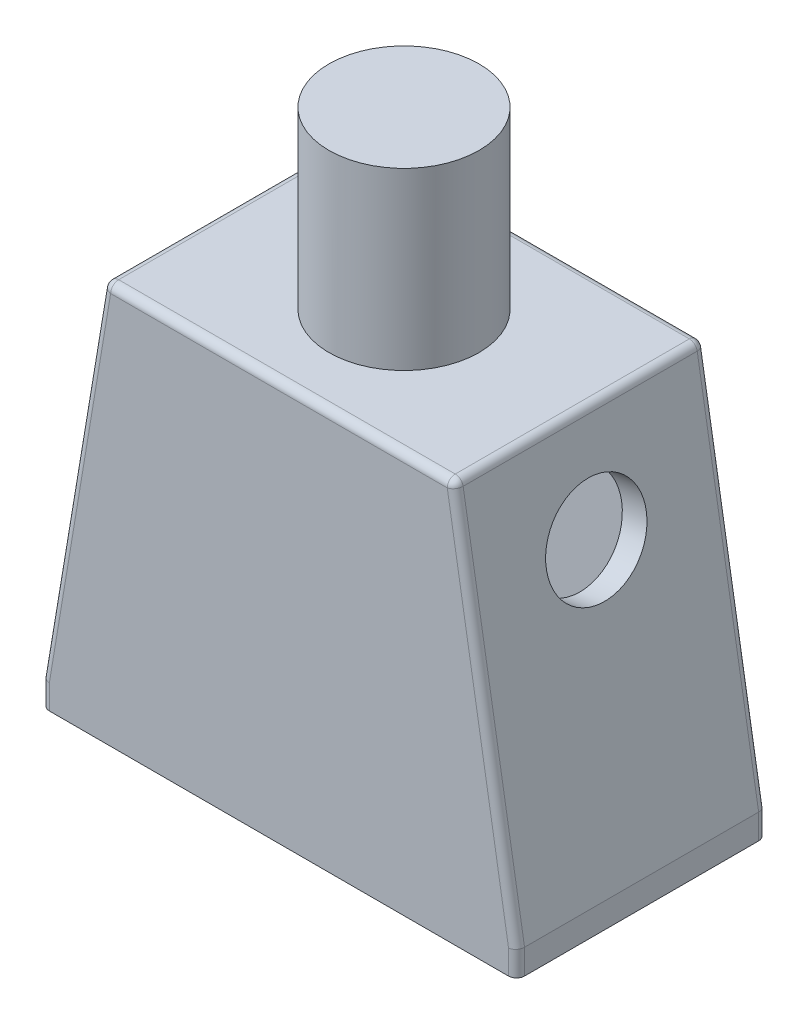
ISO-10303-21;
HEADER;
FILE_DESCRIPTION(('STEP AP214'),'2;1');
FILE_NAME('part.step','',(''),(''),'','','');
FILE_SCHEMA(('AUTOMOTIVE_DESIGN { 1 0 10303 214 1 1 1 1 }'));
ENDSEC;
DATA;
#1=APPLICATION_CONTEXT('core data for automotive mechanical design processes');
#2=APPLICATION_PROTOCOL_DEFINITION('international standard','automotive_design',2000,#1);
#3=PRODUCT_CONTEXT('',#1,'mechanical');
#4=PRODUCT('Part','Part','',(#3));
#5=PRODUCT_RELATED_PRODUCT_CATEGORY('part','',(#4));
#6=PRODUCT_DEFINITION_FORMATION('','',#4);
#7=PRODUCT_DEFINITION_CONTEXT('part definition',#1,'design');
#8=PRODUCT_DEFINITION('design','',#6,#7);
#9=PRODUCT_DEFINITION_SHAPE('','',#8);
#10=(LENGTH_UNIT() NAMED_UNIT(*) SI_UNIT(.MILLI.,.METRE.));
#11=(NAMED_UNIT(*) PLANE_ANGLE_UNIT() SI_UNIT($,.RADIAN.));
#12=(NAMED_UNIT(*) SI_UNIT($,.STERADIAN.) SOLID_ANGLE_UNIT());
#13=UNCERTAINTY_MEASURE_WITH_UNIT(LENGTH_MEASURE(1.E-05),#10,'distance_accuracy_value','');
#14=(GEOMETRIC_REPRESENTATION_CONTEXT(3) GLOBAL_UNCERTAINTY_ASSIGNED_CONTEXT((#13)) GLOBAL_UNIT_ASSIGNED_CONTEXT((#10,
#11,#12)) REPRESENTATION_CONTEXT('',''));
#15=CARTESIAN_POINT('',(0.,0.,0.));
#16=DIRECTION('',(0.,0.,1.));
#17=DIRECTION('',(1.,0.,0.));
#18=AXIS2_PLACEMENT_3D('',#15,#16,#17);
#19=CARTESIAN_POINT('',(0.,0.,3.96875));
#20=DIRECTION('',(0.,1.,0.));
#21=DIRECTION('',(-1.,0.,0.));
#22=AXIS2_PLACEMENT_3D('',#19,#20,#21);
#23=PLANE('',#22);
#24=DIRECTION('',(0.,0.,-1.));
#25=VECTOR('',#24,1.);
#26=CARTESIAN_POINT('',(0.,0.,3.96875));
#27=LINE('',#26,#25);
#28=CARTESIAN_POINT('',(0.,0.,3.71475));
#29=VERTEX_POINT('',#28);
#30=CARTESIAN_POINT('',(0.,0.,-3.71475));
#31=VERTEX_POINT('',#30);
#32=EDGE_CURVE('E282',#29,#31,#27,.T.);
#33=ORIENTED_EDGE('',*,*,#32,.T.);
#34=CARTESIAN_POINT('',(0.254,0.,-3.71475));
#35=DIRECTION('',(0.,1.,0.));
#36=DIRECTION('',(-1.,0.,0.));
#37=AXIS2_PLACEMENT_3D('',#34,#35,#36);
#38=CIRCLE('',#37,0.254);
#39=CARTESIAN_POINT('',(0.254,0.,-3.96875));
#40=VERTEX_POINT('',#39);
#41=EDGE_CURVE('E302',#31,#40,#38,.F.);
#42=ORIENTED_EDGE('',*,*,#41,.T.);
#43=DIRECTION('',(1.,0.,0.));
#44=VECTOR('',#43,1.);
#45=CARTESIAN_POINT('',(0.,0.,-3.96875));
#46=LINE('',#45,#44);
#47=CARTESIAN_POINT('',(14.82725,0.,-3.96875));
#48=VERTEX_POINT('',#47);
#49=EDGE_CURVE('E266',#40,#48,#46,.T.);
#50=ORIENTED_EDGE('',*,*,#49,.T.);
#51=CARTESIAN_POINT('',(14.82725,0.,-3.71475));
#52=DIRECTION('',(0.,1.,0.));
#53=DIRECTION('',(-1.,0.,0.));
#54=AXIS2_PLACEMENT_3D('',#51,#52,#53);
#55=CIRCLE('',#54,0.254);
#56=CARTESIAN_POINT('',(15.08125,0.,-3.71475));
#57=VERTEX_POINT('',#56);
#58=EDGE_CURVE('E299',#48,#57,#55,.F.);
#59=ORIENTED_EDGE('',*,*,#58,.T.);
#60=DIRECTION('',(0.,0.,-1.));
#61=VECTOR('',#60,1.);
#62=CARTESIAN_POINT('',(15.08125,0.,3.96875));
#63=LINE('',#62,#61);
#64=CARTESIAN_POINT('',(15.08125,0.,3.71475));
#65=VERTEX_POINT('',#64);
#66=EDGE_CURVE('E278',#65,#57,#63,.T.);
#67=ORIENTED_EDGE('',*,*,#66,.F.);
#68=CARTESIAN_POINT('',(14.82725,0.,3.71475));
#69=DIRECTION('',(0.,1.,0.));
#70=DIRECTION('',(-1.,0.,0.));
#71=AXIS2_PLACEMENT_3D('',#68,#69,#70);
#72=CIRCLE('',#71,0.254);
#73=CARTESIAN_POINT('',(14.82725,0.,3.96875));
#74=VERTEX_POINT('',#73);
#75=EDGE_CURVE('E296',#65,#74,#72,.F.);
#76=ORIENTED_EDGE('',*,*,#75,.T.);
#77=DIRECTION('',(1.,0.,0.));
#78=VECTOR('',#77,1.);
#79=CARTESIAN_POINT('',(0.,0.,3.96875));
#80=LINE('',#79,#78);
#81=CARTESIAN_POINT('',(0.254,0.,3.96875));
#82=VERTEX_POINT('',#81);
#83=EDGE_CURVE('E261',#82,#74,#80,.T.);
#84=ORIENTED_EDGE('',*,*,#83,.F.);
#85=CARTESIAN_POINT('',(0.254,0.,3.71475));
#86=DIRECTION('',(0.,1.,0.));
#87=DIRECTION('',(-1.,0.,0.));
#88=AXIS2_PLACEMENT_3D('',#85,#86,#87);
#89=CIRCLE('',#88,0.254);
#90=EDGE_CURVE('E293',#82,#29,#89,.F.);
#91=ORIENTED_EDGE('',*,*,#90,.T.);
#92=EDGE_LOOP('',(#33,#42,#50,#59,#67,#76,#84,#91));
#93=FACE_BOUND('',#92,.T.);
#94=DIRECTION('',(0.,0.,-1.));
#95=VECTOR('',#94,1.);
#96=CARTESIAN_POINT('',(0.79375,0.,3.96875));
#97=LINE('',#96,#95);
#98=CARTESIAN_POINT('',(0.79375,0.,3.175));
#99=VERTEX_POINT('',#98);
#100=CARTESIAN_POINT('',(0.79375,0.,-3.175));
#101=VERTEX_POINT('',#100);
#102=EDGE_CURVE('E188',#99,#101,#97,.T.);
#103=ORIENTED_EDGE('',*,*,#102,.F.);
#104=DIRECTION('',(1.,0.,0.));
#105=VECTOR('',#104,1.);
#106=CARTESIAN_POINT('',(0.,0.,3.175));
#107=LINE('',#106,#105);
#108=CARTESIAN_POINT('',(14.2875,0.,3.175));
#109=VERTEX_POINT('',#108);
#110=EDGE_CURVE('E212',#99,#109,#107,.T.);
#111=ORIENTED_EDGE('',*,*,#110,.T.);
#112=DIRECTION('',(0.,0.,-1.));
#113=VECTOR('',#112,1.);
#114=CARTESIAN_POINT('',(14.2875,0.,3.96875));
#115=LINE('',#114,#113);
#116=CARTESIAN_POINT('',(14.2875,0.,-3.175));
#117=VERTEX_POINT('',#116);
#118=EDGE_CURVE('E59',#109,#117,#115,.T.);
#119=ORIENTED_EDGE('',*,*,#118,.T.);
#120=DIRECTION('',(1.,0.,0.));
#121=VECTOR('',#120,1.);
#122=CARTESIAN_POINT('',(0.,0.,-3.175));
#123=LINE('',#122,#121);
#124=EDGE_CURVE('E220',#101,#117,#123,.T.);
#125=ORIENTED_EDGE('',*,*,#124,.F.);
#126=EDGE_LOOP('',(#103,#111,#119,#125));
#127=FACE_BOUND('',#126,.T.);
#128=ADVANCED_FACE('F41',(#93,#127),#23,.F.);
#129=CARTESIAN_POINT('',(0.,0.,3.96875));
#130=DIRECTION('',(1.,0.,0.));
#131=DIRECTION('',(0.,0.,-1.));
#132=AXIS2_PLACEMENT_3D('',#129,#130,#131);
#133=PLANE('',#132);
#134=DIRECTION('',(0.,0.,-1.));
#135=VECTOR('',#134,1.);
#136=CARTESIAN_POINT('',(0.,0.79375,3.96875));
#137=LINE('',#136,#135);
#138=CARTESIAN_POINT('',(0.,0.79375,3.71475));
#139=VERTEX_POINT('',#138);
#140=CARTESIAN_POINT('',(0.,0.79375,-3.71475));
#141=VERTEX_POINT('',#140);
#142=EDGE_CURVE('E265',#139,#141,#137,.T.);
#143=ORIENTED_EDGE('',*,*,#142,.T.);
#144=DIRECTION('',(0.,-1.,0.));
#145=VECTOR('',#144,1.);
#146=CARTESIAN_POINT('',(0.,0.,-3.71475));
#147=LINE('',#146,#145);
#148=EDGE_CURVE('E289',#141,#31,#147,.T.);
#149=ORIENTED_EDGE('',*,*,#148,.T.);
#150=ORIENTED_EDGE('',*,*,#32,.F.);
#151=DIRECTION('',(0.,-1.,0.));
#152=VECTOR('',#151,1.);
#153=CARTESIAN_POINT('',(0.,0.,3.71475));
#154=LINE('',#153,#152);
#155=EDGE_CURVE('E286',#29,#139,#154,.F.);
#156=ORIENTED_EDGE('',*,*,#155,.T.);
#157=EDGE_LOOP('',(#143,#149,#150,#156));
#158=FACE_BOUND('',#157,.T.);
#159=ADVANCED_FACE('F473',(#158),#133,.F.);
#160=CARTESIAN_POINT('',(15.08125,0.,3.96875));
#161=DIRECTION('',(-1.,0.,0.));
#162=DIRECTION('',(0.,0.,1.));
#163=AXIS2_PLACEMENT_3D('',#160,#161,#162);
#164=PLANE('',#163);
#165=ORIENTED_EDGE('',*,*,#66,.T.);
#166=DIRECTION('',(0.,1.,0.));
#167=VECTOR('',#166,1.);
#168=CARTESIAN_POINT('',(15.08125,0.793750000000002,-3.71475));
#169=LINE('',#168,#167);
#170=CARTESIAN_POINT('',(15.08125,0.793750000000002,-3.71475));
#171=VERTEX_POINT('',#170);
#172=EDGE_CURVE('E323',#57,#171,#169,.T.);
#173=ORIENTED_EDGE('',*,*,#172,.T.);
#174=DIRECTION('',(0.,0.,-1.));
#175=VECTOR('',#174,1.);
#176=CARTESIAN_POINT('',(15.08125,0.793750000000002,3.96875));
#177=LINE('',#176,#175);
#178=CARTESIAN_POINT('',(15.08125,0.793750000000002,3.71475));
#179=VERTEX_POINT('',#178);
#180=EDGE_CURVE('E274',#179,#171,#177,.T.);
#181=ORIENTED_EDGE('',*,*,#180,.F.);
#182=DIRECTION('',(0.,1.,0.));
#183=VECTOR('',#182,1.);
#184=CARTESIAN_POINT('',(15.08125,0.,3.71475));
#185=LINE('',#184,#183);
#186=EDGE_CURVE('E320',#179,#65,#185,.F.);
#187=ORIENTED_EDGE('',*,*,#186,.T.);
#188=EDGE_LOOP('',(#165,#173,#181,#187));
#189=FACE_BOUND('',#188,.T.);
#190=ADVANCED_FACE('F479',(#189),#164,.F.);
#191=CARTESIAN_POINT('',(13.096875,12.7,3.96875));
#192=DIRECTION('',(-0.986393923832144,-0.164398987305357,0.));
#193=DIRECTION('',(0.164398987305357,-0.986393923832144,0.));
#194=AXIS2_PLACEMENT_3D('',#191,#192,#193);
#195=PLANE('',#194);
#196=CARTESIAN_POINT('',(13.6440658621327,9.41685482720388,0.));
#197=DIRECTION('',(0.986393923832144,0.164398987305357,0.));
#198=DIRECTION('',(-0.164398987305357,0.986393923832144,0.));
#199=AXIS2_PLACEMENT_3D('',#196,#197,#198);
#200=CIRCLE('',#199,1.5875);
#201=CARTESIAN_POINT('',(13.3830824697854,10.9827551812874,0.));
#202=VERTEX_POINT('',#201);
#203=EDGE_CURVE('E434',#202,#202,#200,.T.);
#204=ORIENTED_EDGE('',*,*,#203,.F.);
#205=EDGE_LOOP('',(#204));
#206=FACE_BOUND('',#205,.T.);
#207=ORIENTED_EDGE('',*,*,#180,.T.);
#208=DIRECTION('',(-0.164398987305357,0.986393923832144,0.));
#209=VECTOR('',#208,1.);
#210=CARTESIAN_POINT('',(13.096875,12.7,-3.71475));
#211=LINE('',#210,#209);
#212=CARTESIAN_POINT('',(13.1322487762041,12.4877573427756,-3.71475));
#213=VERTEX_POINT('',#212);
#214=EDGE_CURVE('E360',#171,#213,#211,.T.);
#215=ORIENTED_EDGE('',*,*,#214,.T.);
#216=DIRECTION('',(0.,0.,-1.));
#217=VECTOR('',#216,1.);
#218=CARTESIAN_POINT('',(13.1322487762041,12.4877573427756,3.96875));
#219=LINE('',#218,#217);
#220=CARTESIAN_POINT('',(13.1322487762041,12.4877573427756,3.71475));
#221=VERTEX_POINT('',#220);
#222=EDGE_CURVE('E357',#213,#221,#219,.F.);
#223=ORIENTED_EDGE('',*,*,#222,.T.);
#224=DIRECTION('',(-0.164398987305357,0.986393923832144,0.));
#225=VECTOR('',#224,1.);
#226=CARTESIAN_POINT('',(13.096875,12.7,3.71475));
#227=LINE('',#226,#225);
#228=EDGE_CURVE('E354',#221,#179,#227,.F.);
#229=ORIENTED_EDGE('',*,*,#228,.T.);
#230=EDGE_LOOP('',(#207,#215,#223,#229));
#231=FACE_BOUND('',#230,.T.);
#232=ADVANCED_FACE('F468',(#206,#231),#195,.F.);
#233=CARTESIAN_POINT('',(1.984375,12.7,3.96875));
#234=DIRECTION('',(0.,-1.,0.));
#235=DIRECTION('',(1.,0.,0.));
#236=AXIS2_PLACEMENT_3D('',#233,#234,#235);
#237=PLANE('',#236);
#238=CARTESIAN_POINT('',(7.540625,12.7,0.));
#239=DIRECTION('',(0.,-1.,0.));
#240=DIRECTION('',(1.,0.,0.));
#241=AXIS2_PLACEMENT_3D('',#238,#239,#240);
#242=CIRCLE('',#241,2.38125000000002);
#243=CARTESIAN_POINT('',(9.92187500000002,12.7,0.));
#244=VERTEX_POINT('',#243);
#245=EDGE_CURVE('E11',#244,#244,#242,.F.);
#246=ORIENTED_EDGE('',*,*,#245,.F.);
#247=EDGE_LOOP('',(#246));
#248=FACE_BOUND('',#247,.T.);
#249=DIRECTION('',(-1.,0.,0.));
#250=VECTOR('',#249,1.);
#251=CARTESIAN_POINT('',(1.984375,12.7,3.71475));
#252=LINE('',#251,#250);
#253=CARTESIAN_POINT('',(2.19954528044929,12.7,3.71475));
#254=VERTEX_POINT('',#253);
#255=CARTESIAN_POINT('',(12.8817047195507,12.7,3.71475));
#256=VERTEX_POINT('',#255);
#257=EDGE_CURVE('E347',#254,#256,#252,.F.);
#258=ORIENTED_EDGE('',*,*,#257,.T.);
#259=DIRECTION('',(0.,0.,-1.));
#260=VECTOR('',#259,1.);
#261=CARTESIAN_POINT('',(12.8817047195507,12.7,3.96875));
#262=LINE('',#261,#260);
#263=CARTESIAN_POINT('',(12.8817047195507,12.7,-3.71475));
#264=VERTEX_POINT('',#263);
#265=EDGE_CURVE('E350',#256,#264,#262,.T.);
#266=ORIENTED_EDGE('',*,*,#265,.T.);
#267=DIRECTION('',(-1.,0.,0.));
#268=VECTOR('',#267,1.);
#269=CARTESIAN_POINT('',(1.984375,12.7,-3.71475));
#270=LINE('',#269,#268);
#271=CARTESIAN_POINT('',(2.19954528044929,12.7,-3.71475));
#272=VERTEX_POINT('',#271);
#273=EDGE_CURVE('E341',#264,#272,#270,.T.);
#274=ORIENTED_EDGE('',*,*,#273,.T.);
#275=DIRECTION('',(0.,0.,-1.));
#276=VECTOR('',#275,1.);
#277=CARTESIAN_POINT('',(2.19954528044929,12.7,3.96875));
#278=LINE('',#277,#276);
#279=EDGE_CURVE('E344',#272,#254,#278,.F.);
#280=ORIENTED_EDGE('',*,*,#279,.T.);
#281=EDGE_LOOP('',(#258,#266,#274,#280));
#282=FACE_BOUND('',#281,.T.);
#283=ADVANCED_FACE('F459',(#248,#282),#237,.F.);
#284=CARTESIAN_POINT('',(0.,0.79375,3.96875));
#285=DIRECTION('',(0.986393923832144,-0.164398987305357,0.));
#286=DIRECTION('',(0.164398987305357,0.986393923832144,0.));
#287=AXIS2_PLACEMENT_3D('',#284,#285,#286);
#288=PLANE('',#287);
#289=CARTESIAN_POINT('',(1.43718413786731,9.41685482720387,0.));
#290=DIRECTION('',(-0.986393923832144,0.164398987305357,0.));
#291=DIRECTION('',(-0.164398987305357,-0.986393923832144,0.));
#292=AXIS2_PLACEMENT_3D('',#289,#290,#291);
#293=CIRCLE('',#292,1.5875);
#294=CARTESIAN_POINT('',(1.17620074552006,7.85095447312035,0.));
#295=VERTEX_POINT('',#294);
#296=EDGE_CURVE('E447',#295,#295,#293,.T.);
#297=ORIENTED_EDGE('',*,*,#296,.F.);
#298=EDGE_LOOP('',(#297));
#299=FACE_BOUND('',#298,.T.);
#300=DIRECTION('',(0.,0.,-1.));
#301=VECTOR('',#300,1.);
#302=CARTESIAN_POINT('',(1.94900122379593,12.4877573427756,3.96875));
#303=LINE('',#302,#301);
#304=CARTESIAN_POINT('',(1.94900122379593,12.4877573427756,3.71475));
#305=VERTEX_POINT('',#304);
#306=CARTESIAN_POINT('',(1.94900122379593,12.4877573427756,-3.71475));
#307=VERTEX_POINT('',#306);
#308=EDGE_CURVE('E67',#305,#307,#303,.T.);
#309=ORIENTED_EDGE('',*,*,#308,.T.);
#310=DIRECTION('',(-0.164398987305357,-0.986393923832144,0.));
#311=VECTOR('',#310,1.);
#312=CARTESIAN_POINT('',(0.,0.79375,-3.71475));
#313=LINE('',#312,#311);
#314=EDGE_CURVE('E51',#307,#141,#313,.T.);
#315=ORIENTED_EDGE('',*,*,#314,.T.);
#316=ORIENTED_EDGE('',*,*,#142,.F.);
#317=DIRECTION('',(-0.164398987305357,-0.986393923832144,0.));
#318=VECTOR('',#317,1.);
#319=CARTESIAN_POINT('',(0.,0.79375,3.71475));
#320=LINE('',#319,#318);
#321=EDGE_CURVE('E363',#139,#305,#320,.F.);
#322=ORIENTED_EDGE('',*,*,#321,.T.);
#323=EDGE_LOOP('',(#309,#315,#316,#322));
#324=FACE_BOUND('',#323,.T.);
#325=ADVANCED_FACE('F456',(#299,#324),#288,.F.);
#326=CARTESIAN_POINT('',(0.,0.,3.96875));
#327=DIRECTION('',(0.,0.,-1.));
#328=DIRECTION('',(-1.,0.,0.));
#329=AXIS2_PLACEMENT_3D('',#326,#327,#328);
#330=PLANE('',#329);
#331=DIRECTION('',(-0.164398987305357,-0.986393923832144,0.));
#332=VECTOR('',#331,1.);
#333=CARTESIAN_POINT('',(0.121827840437148,-0.0203046400728581,3.96875));
#334=LINE('',#333,#332);
#335=CARTESIAN_POINT('',(2.19954528044929,12.446,3.96875));
#336=VERTEX_POINT('',#335);
#337=CARTESIAN_POINT('',(0.254,0.772728317304252,3.96875));
#338=VERTEX_POINT('',#337);
#339=EDGE_CURVE('E335',#336,#338,#334,.T.);
#340=ORIENTED_EDGE('',*,*,#339,.T.);
#341=DIRECTION('',(0.,-1.,0.));
#342=VECTOR('',#341,1.);
#343=CARTESIAN_POINT('',(0.254,0.,3.96875));
#344=LINE('',#343,#342);
#345=EDGE_CURVE('E338',#338,#82,#344,.T.);
#346=ORIENTED_EDGE('',*,*,#345,.T.);
#347=ORIENTED_EDGE('',*,*,#83,.T.);
#348=DIRECTION('',(0.,1.,0.));
#349=VECTOR('',#348,1.);
#350=CARTESIAN_POINT('',(14.82725,0.,3.96875));
#351=LINE('',#350,#349);
#352=CARTESIAN_POINT('',(14.82725,0.772728317304272,3.96875));
#353=VERTEX_POINT('',#352);
#354=EDGE_CURVE('E332',#74,#353,#351,.T.);
#355=ORIENTED_EDGE('',*,*,#354,.T.);
#356=DIRECTION('',(-0.164398987305357,0.986393923832144,0.));
#357=VECTOR('',#356,1.);
#358=CARTESIAN_POINT('',(14.5518208082115,2.42530346803525,3.96875));
#359=LINE('',#358,#357);
#360=CARTESIAN_POINT('',(12.8817047195507,12.446,3.96875));
#361=VERTEX_POINT('',#360);
#362=EDGE_CURVE('E326',#353,#361,#359,.T.);
#363=ORIENTED_EDGE('',*,*,#362,.T.);
#364=DIRECTION('',(-1.,0.,0.));
#365=VECTOR('',#364,1.);
#366=CARTESIAN_POINT('',(0.,12.446,3.96875));
#367=LINE('',#366,#365);
#368=EDGE_CURVE('E329',#361,#336,#367,.T.);
#369=ORIENTED_EDGE('',*,*,#368,.T.);
#370=EDGE_LOOP('',(#340,#346,#347,#355,#363,#369));
#371=FACE_BOUND('',#370,.T.);
#372=ADVANCED_FACE('F458',(#371),#330,.F.);
#373=CARTESIAN_POINT('',(0.,0.,-3.96875));
#374=DIRECTION('',(0.,0.,-1.));
#375=DIRECTION('',(-1.,0.,0.));
#376=AXIS2_PLACEMENT_3D('',#373,#374,#375);
#377=PLANE('',#376);
#378=ORIENTED_EDGE('',*,*,#49,.F.);
#379=DIRECTION('',(0.,-1.,0.));
#380=VECTOR('',#379,1.);
#381=CARTESIAN_POINT('',(0.254,0.79375,-3.96875));
#382=LINE('',#381,#380);
#383=CARTESIAN_POINT('',(0.254,0.772728317304252,-3.96875));
#384=VERTEX_POINT('',#383);
#385=EDGE_CURVE('E317',#40,#384,#382,.F.);
#386=ORIENTED_EDGE('',*,*,#385,.T.);
#387=DIRECTION('',(-0.164398987305357,-0.986393923832144,0.));
#388=VECTOR('',#387,1.);
#389=CARTESIAN_POINT('',(2.23491905665336,12.6582426572244,-3.96875));
#390=LINE('',#389,#388);
#391=CARTESIAN_POINT('',(2.19954528044929,12.446,-3.96875));
#392=VERTEX_POINT('',#391);
#393=EDGE_CURVE('E314',#384,#392,#390,.F.);
#394=ORIENTED_EDGE('',*,*,#393,.T.);
#395=DIRECTION('',(-1.,0.,0.));
#396=VECTOR('',#395,1.);
#397=CARTESIAN_POINT('',(13.096875,12.446,-3.96875));
#398=LINE('',#397,#396);
#399=CARTESIAN_POINT('',(12.8817047195507,12.446,-3.96875));
#400=VERTEX_POINT('',#399);
#401=EDGE_CURVE('E308',#392,#400,#398,.F.);
#402=ORIENTED_EDGE('',*,*,#401,.T.);
#403=DIRECTION('',(-0.164398987305357,0.986393923832144,0.));
#404=VECTOR('',#403,1.);
#405=CARTESIAN_POINT('',(14.8307059433466,0.751992657224436,-3.96875));
#406=LINE('',#405,#404);
#407=CARTESIAN_POINT('',(14.82725,0.772728317304265,-3.96875));
#408=VERTEX_POINT('',#407);
#409=EDGE_CURVE('E305',#400,#408,#406,.F.);
#410=ORIENTED_EDGE('',*,*,#409,.T.);
#411=DIRECTION('',(0.,1.,0.));
#412=VECTOR('',#411,1.);
#413=CARTESIAN_POINT('',(14.82725,0.,-3.96875));
#414=LINE('',#413,#412);
#415=EDGE_CURVE('E311',#408,#48,#414,.F.);
#416=ORIENTED_EDGE('',*,*,#415,.T.);
#417=EDGE_LOOP('',(#378,#386,#394,#402,#410,#416));
#418=FACE_BOUND('',#417,.T.);
#419=ADVANCED_FACE('F465',(#418),#377,.T.);
#420=CARTESIAN_POINT('',(14.82725,0.,3.71475));
#421=DIRECTION('',(0.,1.,0.));
#422=DIRECTION('',(0.,0.,1.));
#423=AXIS2_PLACEMENT_3D('',#420,#421,#422);
#424=CYLINDRICAL_SURFACE('',#423,0.254);
#425=ORIENTED_EDGE('',*,*,#75,.F.);
#426=ORIENTED_EDGE('',*,*,#186,.F.);
#427=CARTESIAN_POINT('',(14.82725,0.772728317304277,3.71475));
#428=DIRECTION('',(-0.0824805315448933,0.996592676029717,0.));
#429=DIRECTION('',(-0.996592676029717,-0.0824805315448924,0.));
#430=AXIS2_PLACEMENT_3D('',#427,#428,#429);
#431=ELLIPSE('',#430,0.254868419274261,0.254);
#432=EDGE_CURVE('E270',#353,#179,#431,.T.);
#433=ORIENTED_EDGE('',*,*,#432,.F.);
#434=ORIENTED_EDGE('',*,*,#354,.F.);
#435=EDGE_LOOP('',(#425,#426,#433,#434));
#436=FACE_BOUND('',#435,.T.);
#437=ADVANCED_FACE('F43',(#436),#424,.T.);
#438=CARTESIAN_POINT('',(14.5518208082115,2.42530346803525,3.71475));
#439=DIRECTION('',(-0.164398987305357,0.986393923832144,0.));
#440=DIRECTION('',(-0.986393923832144,-0.164398987305357,0.));
#441=AXIS2_PLACEMENT_3D('',#438,#439,#440);
#442=CYLINDRICAL_SURFACE('',#441,0.254);
#443=ORIENTED_EDGE('',*,*,#432,.T.);
#444=ORIENTED_EDGE('',*,*,#228,.F.);
#445=CARTESIAN_POINT('',(12.8817047195507,12.446,3.71475));
#446=DIRECTION('',(-0.164398987305361,0.986393923832143,0.));
#447=DIRECTION('',(-0.986393923832143,-0.164398987305361,0.));
#448=AXIS2_PLACEMENT_3D('',#445,#446,#447);
#449=CIRCLE('',#448,0.254);
#450=EDGE_CURVE('E425',#361,#221,#449,.T.);
#451=ORIENTED_EDGE('',*,*,#450,.F.);
#452=ORIENTED_EDGE('',*,*,#362,.F.);
#453=EDGE_LOOP('',(#443,#444,#451,#452));
#454=FACE_BOUND('',#453,.T.);
#455=ADVANCED_FACE('F540',(#454),#442,.T.);
#456=CARTESIAN_POINT('',(14.82725,0.,-3.71475));
#457=DIRECTION('',(0.,-1.,0.));
#458=DIRECTION('',(0.,0.,-1.));
#459=AXIS2_PLACEMENT_3D('',#456,#457,#458);
#460=CYLINDRICAL_SURFACE('',#459,0.254);
#461=ORIENTED_EDGE('',*,*,#58,.F.);
#462=ORIENTED_EDGE('',*,*,#415,.F.);
#463=CARTESIAN_POINT('',(14.82725,0.772728317304266,-3.71475));
#464=DIRECTION('',(0.0824805315448933,-0.996592676029717,0.));
#465=DIRECTION('',(0.996592676029717,0.0824805315448924,0.));
#466=AXIS2_PLACEMENT_3D('',#463,#464,#465);
#467=ELLIPSE('',#466,0.254868419274261,0.254);
#468=EDGE_CURVE('E421',#171,#408,#467,.F.);
#469=ORIENTED_EDGE('',*,*,#468,.F.);
#470=ORIENTED_EDGE('',*,*,#172,.F.);
#471=EDGE_LOOP('',(#461,#462,#469,#470));
#472=FACE_BOUND('',#471,.T.);
#473=ADVANCED_FACE('F537',(#472),#460,.T.);
#474=CARTESIAN_POINT('',(12.8817047195507,12.446,3.71475));
#475=DIRECTION('',(0.,0.,1.));
#476=DIRECTION('',(1.,0.,0.));
#477=AXIS2_PLACEMENT_3D('',#474,#475,#476);
#478=SPHERICAL_SURFACE('',#477,0.254);
#479=CARTESIAN_POINT('',(12.8817047195507,12.446,3.71475));
#480=DIRECTION('',(1.,0.,0.));
#481=DIRECTION('',(0.,0.,-1.));
#482=AXIS2_PLACEMENT_3D('',#479,#480,#481);
#483=CIRCLE('',#482,0.254);
#484=EDGE_CURVE('E413',#361,#256,#483,.F.);
#485=ORIENTED_EDGE('',*,*,#484,.F.);
#486=ORIENTED_EDGE('',*,*,#450,.T.);
#487=CARTESIAN_POINT('',(12.8817047195507,12.446,3.71475));
#488=DIRECTION('',(0.,0.,1.));
#489=DIRECTION('',(1.,0.,0.));
#490=AXIS2_PLACEMENT_3D('',#487,#488,#489);
#491=CIRCLE('',#490,0.254);
#492=EDGE_CURVE('E417',#256,#221,#491,.F.);
#493=ORIENTED_EDGE('',*,*,#492,.F.);
#494=EDGE_LOOP('',(#485,#486,#493));
#495=FACE_BOUND('',#494,.T.);
#496=ADVANCED_FACE('F533',(#495),#478,.T.);
#497=CARTESIAN_POINT('',(0.254,0.,3.71475));
#498=DIRECTION('',(0.,-1.,0.));
#499=DIRECTION('',(0.,0.,-1.));
#500=AXIS2_PLACEMENT_3D('',#497,#498,#499);
#501=CYLINDRICAL_SURFACE('',#500,0.254);
#502=ORIENTED_EDGE('',*,*,#90,.F.);
#503=ORIENTED_EDGE('',*,*,#345,.F.);
#504=CARTESIAN_POINT('',(0.254,0.772728317304252,3.71475));
#505=DIRECTION('',(-0.0824805315448932,-0.996592676029717,0.));
#506=DIRECTION('',(-0.996592676029717,0.0824805315448925,0.));
#507=AXIS2_PLACEMENT_3D('',#504,#505,#506);
#508=ELLIPSE('',#507,0.254868419274261,0.254);
#509=EDGE_CURVE('E409',#139,#338,#508,.F.);
#510=ORIENTED_EDGE('',*,*,#509,.F.);
#511=ORIENTED_EDGE('',*,*,#155,.F.);
#512=EDGE_LOOP('',(#502,#503,#510,#511));
#513=FACE_BOUND('',#512,.T.);
#514=ADVANCED_FACE('F529',(#513),#501,.T.);
#515=CARTESIAN_POINT('',(12.8463309433466,12.6582426572244,-3.71475));
#516=DIRECTION('',(0.164398987305357,-0.986393923832144,0.));
#517=DIRECTION('',(0.986393923832144,0.164398987305357,0.));
#518=AXIS2_PLACEMENT_3D('',#515,#516,#517);
#519=CYLINDRICAL_SURFACE('',#518,0.254);
#520=ORIENTED_EDGE('',*,*,#468,.T.);
#521=ORIENTED_EDGE('',*,*,#409,.F.);
#522=CARTESIAN_POINT('',(12.8817047195507,12.446,-3.71475));
#523=DIRECTION('',(-0.164398987305359,0.986393923832143,0.));
#524=DIRECTION('',(-0.986393923832143,-0.164398987305359,0.));
#525=AXIS2_PLACEMENT_3D('',#522,#523,#524);
#526=CIRCLE('',#525,0.254);
#527=EDGE_CURVE('E405',#213,#400,#526,.T.);
#528=ORIENTED_EDGE('',*,*,#527,.F.);
#529=ORIENTED_EDGE('',*,*,#214,.F.);
#530=EDGE_LOOP('',(#520,#521,#528,#529));
#531=FACE_BOUND('',#530,.T.);
#532=ADVANCED_FACE('F525',(#531),#519,.T.);
#533=CARTESIAN_POINT('',(12.8817047195507,12.446,3.96875));
#534=DIRECTION('',(0.,0.,-1.));
#535=DIRECTION('',(-1.,0.,0.));
#536=AXIS2_PLACEMENT_3D('',#533,#534,#535);
#537=CYLINDRICAL_SURFACE('',#536,0.254);
#538=ORIENTED_EDGE('',*,*,#492,.T.);
#539=ORIENTED_EDGE('',*,*,#222,.F.);
#540=CARTESIAN_POINT('',(12.8817047195507,12.446,-3.71475));
#541=DIRECTION('',(0.,0.,-1.));
#542=DIRECTION('',(-1.,0.,0.));
#543=AXIS2_PLACEMENT_3D('',#540,#541,#542);
#544=CIRCLE('',#543,0.254);
#545=EDGE_CURVE('E401',#264,#213,#544,.T.);
#546=ORIENTED_EDGE('',*,*,#545,.F.);
#547=ORIENTED_EDGE('',*,*,#265,.F.);
#548=EDGE_LOOP('',(#538,#539,#546,#547));
#549=FACE_BOUND('',#548,.T.);
#550=ADVANCED_FACE('F521',(#549),#537,.T.);
#551=CARTESIAN_POINT('',(0.,12.446,3.71475));
#552=DIRECTION('',(-1.,0.,0.));
#553=DIRECTION('',(0.,-1.,0.));
#554=AXIS2_PLACEMENT_3D('',#551,#552,#553);
#555=CYLINDRICAL_SURFACE('',#554,0.254);
#556=ORIENTED_EDGE('',*,*,#484,.T.);
#557=ORIENTED_EDGE('',*,*,#257,.F.);
#558=CARTESIAN_POINT('',(2.19954528044929,12.446,3.71475));
#559=DIRECTION('',(-1.,0.,0.));
#560=DIRECTION('',(0.,0.,1.));
#561=AXIS2_PLACEMENT_3D('',#558,#559,#560);
#562=CIRCLE('',#561,0.254);
#563=EDGE_CURVE('E397',#336,#254,#562,.T.);
#564=ORIENTED_EDGE('',*,*,#563,.F.);
#565=ORIENTED_EDGE('',*,*,#368,.F.);
#566=EDGE_LOOP('',(#556,#557,#564,#565));
#567=FACE_BOUND('',#566,.T.);
#568=ADVANCED_FACE('F517',(#567),#555,.T.);
#569=CARTESIAN_POINT('',(0.121827840437148,-0.0203046400728581,3.71475));
#570=DIRECTION('',(-0.164398987305357,-0.986393923832144,0.));
#571=DIRECTION('',(0.986393923832144,-0.164398987305357,0.));
#572=AXIS2_PLACEMENT_3D('',#569,#570,#571);
#573=CYLINDRICAL_SURFACE('',#572,0.254);
#574=ORIENTED_EDGE('',*,*,#509,.T.);
#575=ORIENTED_EDGE('',*,*,#339,.F.);
#576=CARTESIAN_POINT('',(2.19954528044929,12.446,3.71475));
#577=DIRECTION('',(0.164398987305359,0.986393923832143,0.));
#578=DIRECTION('',(-0.986393923832143,0.164398987305359,0.));
#579=AXIS2_PLACEMENT_3D('',#576,#577,#578);
#580=CIRCLE('',#579,0.254);
#581=EDGE_CURVE('E393',#305,#336,#580,.T.);
#582=ORIENTED_EDGE('',*,*,#581,.F.);
#583=ORIENTED_EDGE('',*,*,#321,.F.);
#584=EDGE_LOOP('',(#574,#575,#582,#583));
#585=FACE_BOUND('',#584,.T.);
#586=ADVANCED_FACE('F513',(#585),#573,.T.);
#587=CARTESIAN_POINT('',(12.8817047195507,12.446,-3.71475));
#588=DIRECTION('',(0.,0.,-1.));
#589=DIRECTION('',(-1.,0.,0.));
#590=AXIS2_PLACEMENT_3D('',#587,#588,#589);
#591=SPHERICAL_SURFACE('',#590,0.254);
#592=ORIENTED_EDGE('',*,*,#545,.T.);
#593=ORIENTED_EDGE('',*,*,#527,.T.);
#594=CARTESIAN_POINT('',(12.8817047195507,12.446,-3.71475));
#595=DIRECTION('',(1.,0.,0.));
#596=DIRECTION('',(0.,0.,-1.));
#597=AXIS2_PLACEMENT_3D('',#594,#595,#596);
#598=CIRCLE('',#597,0.254);
#599=EDGE_CURVE('E389',#264,#400,#598,.F.);
#600=ORIENTED_EDGE('',*,*,#599,.F.);
#601=EDGE_LOOP('',(#592,#593,#600));
#602=FACE_BOUND('',#601,.T.);
#603=ADVANCED_FACE('F509',(#602),#591,.T.);
#604=CARTESIAN_POINT('',(2.19954528044929,12.446,3.71475));
#605=DIRECTION('',(0.,0.,1.));
#606=DIRECTION('',(1.,0.,0.));
#607=AXIS2_PLACEMENT_3D('',#604,#605,#606);
#608=SPHERICAL_SURFACE('',#607,0.254);
#609=ORIENTED_EDGE('',*,*,#581,.T.);
#610=ORIENTED_EDGE('',*,*,#563,.T.);
#611=CARTESIAN_POINT('',(2.19954528044929,12.446,3.71475));
#612=DIRECTION('',(0.,0.,1.));
#613=DIRECTION('',(1.,0.,0.));
#614=AXIS2_PLACEMENT_3D('',#611,#612,#613);
#615=CIRCLE('',#614,0.254);
#616=EDGE_CURVE('E385',#305,#254,#615,.F.);
#617=ORIENTED_EDGE('',*,*,#616,.F.);
#618=EDGE_LOOP('',(#609,#610,#617));
#619=FACE_BOUND('',#618,.T.);
#620=ADVANCED_FACE('F505',(#619),#608,.T.);
#621=CARTESIAN_POINT('',(1.984375,12.446,-3.71475));
#622=DIRECTION('',(1.,0.,0.));
#623=DIRECTION('',(0.,1.,0.));
#624=AXIS2_PLACEMENT_3D('',#621,#622,#623);
#625=CYLINDRICAL_SURFACE('',#624,0.254);
#626=ORIENTED_EDGE('',*,*,#599,.T.);
#627=ORIENTED_EDGE('',*,*,#401,.F.);
#628=CARTESIAN_POINT('',(2.19954528044929,12.446,-3.71475));
#629=DIRECTION('',(-1.,0.,0.));
#630=DIRECTION('',(0.,0.,1.));
#631=AXIS2_PLACEMENT_3D('',#628,#629,#630);
#632=CIRCLE('',#631,0.254);
#633=EDGE_CURVE('E381',#272,#392,#632,.T.);
#634=ORIENTED_EDGE('',*,*,#633,.F.);
#635=ORIENTED_EDGE('',*,*,#273,.F.);
#636=EDGE_LOOP('',(#626,#627,#634,#635));
#637=FACE_BOUND('',#636,.T.);
#638=ADVANCED_FACE('F501',(#637),#625,.T.);
#639=CARTESIAN_POINT('',(2.19954528044929,12.446,3.96875));
#640=DIRECTION('',(0.,0.,-1.));
#641=DIRECTION('',(-1.,0.,0.));
#642=AXIS2_PLACEMENT_3D('',#639,#640,#641);
#643=CYLINDRICAL_SURFACE('',#642,0.254);
#644=ORIENTED_EDGE('',*,*,#616,.T.);
#645=ORIENTED_EDGE('',*,*,#279,.F.);
#646=CARTESIAN_POINT('',(2.19954528044929,12.446,-3.71475));
#647=DIRECTION('',(0.,0.,-1.));
#648=DIRECTION('',(-1.,0.,0.));
#649=AXIS2_PLACEMENT_3D('',#646,#647,#648);
#650=CIRCLE('',#649,0.254);
#651=EDGE_CURVE('E377',#307,#272,#650,.T.);
#652=ORIENTED_EDGE('',*,*,#651,.F.);
#653=ORIENTED_EDGE('',*,*,#308,.F.);
#654=EDGE_LOOP('',(#644,#645,#652,#653));
#655=FACE_BOUND('',#654,.T.);
#656=ADVANCED_FACE('F497',(#655),#643,.T.);
#657=CARTESIAN_POINT('',(2.19954528044929,12.446,-3.71475));
#658=DIRECTION('',(0.,0.,-1.));
#659=DIRECTION('',(-1.,0.,0.));
#660=AXIS2_PLACEMENT_3D('',#657,#658,#659);
#661=SPHERICAL_SURFACE('',#660,0.254);
#662=ORIENTED_EDGE('',*,*,#651,.T.);
#663=ORIENTED_EDGE('',*,*,#633,.T.);
#664=CARTESIAN_POINT('',(2.19954528044929,12.446,-3.71475));
#665=DIRECTION('',(0.16439898730536,0.986393923832143,0.));
#666=DIRECTION('',(-0.986393923832143,0.16439898730536,0.));
#667=AXIS2_PLACEMENT_3D('',#664,#665,#666);
#668=CIRCLE('',#667,0.254);
#669=EDGE_CURVE('E373',#307,#392,#668,.F.);
#670=ORIENTED_EDGE('',*,*,#669,.F.);
#671=EDGE_LOOP('',(#662,#663,#670));
#672=FACE_BOUND('',#671,.T.);
#673=ADVANCED_FACE('F493',(#672),#661,.T.);
#674=CARTESIAN_POINT('',(0.250544056653364,0.751992657224439,-3.71475));
#675=DIRECTION('',(0.164398987305357,0.986393923832144,0.));
#676=DIRECTION('',(-0.986393923832144,0.164398987305357,0.));
#677=AXIS2_PLACEMENT_3D('',#674,#675,#676);
#678=CYLINDRICAL_SURFACE('',#677,0.254);
#679=ORIENTED_EDGE('',*,*,#669,.T.);
#680=ORIENTED_EDGE('',*,*,#393,.F.);
#681=CARTESIAN_POINT('',(0.254,0.772728317304251,-3.71475));
#682=DIRECTION('',(0.0824805315448932,0.996592676029717,0.));
#683=DIRECTION('',(0.996592676029717,-0.0824805315448925,0.));
#684=AXIS2_PLACEMENT_3D('',#681,#682,#683);
#685=ELLIPSE('',#684,0.254868419274261,0.254);
#686=EDGE_CURVE('E242',#141,#384,#685,.F.);
#687=ORIENTED_EDGE('',*,*,#686,.F.);
#688=ORIENTED_EDGE('',*,*,#314,.F.);
#689=EDGE_LOOP('',(#679,#680,#687,#688));
#690=FACE_BOUND('',#689,.T.);
#691=ADVANCED_FACE('F489',(#690),#678,.T.);
#692=CARTESIAN_POINT('',(0.254,0.,-3.71475));
#693=DIRECTION('',(0.,1.,0.));
#694=DIRECTION('',(0.,0.,1.));
#695=AXIS2_PLACEMENT_3D('',#692,#693,#694);
#696=CYLINDRICAL_SURFACE('',#695,0.254);
#697=ORIENTED_EDGE('',*,*,#686,.T.);
#698=ORIENTED_EDGE('',*,*,#385,.F.);
#699=ORIENTED_EDGE('',*,*,#41,.F.);
#700=ORIENTED_EDGE('',*,*,#148,.F.);
#701=EDGE_LOOP('',(#697,#698,#699,#700));
#702=FACE_BOUND('',#701,.T.);
#703=ADVANCED_FACE('F486',(#702),#696,.T.);
#704=CARTESIAN_POINT('',(0.79375,0.,3.96875));
#705=DIRECTION('',(1.,0.,0.));
#706=DIRECTION('',(0.,0.,-1.));
#707=AXIS2_PLACEMENT_3D('',#704,#705,#706);
#708=PLANE('',#707);
#709=DIRECTION('',(0.,0.,-1.));
#710=VECTOR('',#709,1.);
#711=CARTESIAN_POINT('',(0.79375,0.728057241575787,3.96875));
#712=LINE('',#711,#710);
#713=CARTESIAN_POINT('',(0.79375,0.728057241575787,3.175));
#714=VERTEX_POINT('',#713);
#715=CARTESIAN_POINT('',(0.79375,0.728057241575787,-3.175));
#716=VERTEX_POINT('',#715);
#717=EDGE_CURVE('E186',#714,#716,#712,.T.);
#718=ORIENTED_EDGE('',*,*,#717,.F.);
#719=DIRECTION('',(0.,-1.,0.));
#720=VECTOR('',#719,1.);
#721=CARTESIAN_POINT('',(0.79375,0.,3.175));
#722=LINE('',#721,#720);
#723=EDGE_CURVE('E226',#714,#99,#722,.T.);
#724=ORIENTED_EDGE('',*,*,#723,.T.);
#725=ORIENTED_EDGE('',*,*,#102,.T.);
#726=DIRECTION('',(0.,1.,0.));
#727=VECTOR('',#726,1.);
#728=CARTESIAN_POINT('',(0.79375,0.,-3.175));
#729=LINE('',#728,#727);
#730=EDGE_CURVE('E182',#101,#716,#729,.T.);
#731=ORIENTED_EDGE('',*,*,#730,.T.);
#732=EDGE_LOOP('',(#718,#724,#725,#731));
#733=FACE_BOUND('',#732,.T.);
#734=ADVANCED_FACE('F184',(#733),#708,.T.);
#735=CARTESIAN_POINT('',(14.2875,0.,3.96875));
#736=DIRECTION('',(-1.,0.,0.));
#737=DIRECTION('',(0.,0.,1.));
#738=AXIS2_PLACEMENT_3D('',#735,#736,#737);
#739=PLANE('',#738);
#740=ORIENTED_EDGE('',*,*,#118,.F.);
#741=DIRECTION('',(0.,-1.,0.));
#742=VECTOR('',#741,1.);
#743=CARTESIAN_POINT('',(14.2875,0.,3.175));
#744=LINE('',#743,#742);
#745=CARTESIAN_POINT('',(14.2875,0.728057241575784,3.175));
#746=VERTEX_POINT('',#745);
#747=EDGE_CURVE('E193',#746,#109,#744,.T.);
#748=ORIENTED_EDGE('',*,*,#747,.F.);
#749=DIRECTION('',(0.,0.,-1.));
#750=VECTOR('',#749,1.);
#751=CARTESIAN_POINT('',(14.2875,0.728057241575786,3.96875));
#752=LINE('',#751,#750);
#753=CARTESIAN_POINT('',(14.2875,0.728057241575784,-3.175));
#754=VERTEX_POINT('',#753);
#755=EDGE_CURVE('E211',#746,#754,#752,.T.);
#756=ORIENTED_EDGE('',*,*,#755,.T.);
#757=DIRECTION('',(0.,-1.,0.));
#758=VECTOR('',#757,1.);
#759=CARTESIAN_POINT('',(14.2875,0.,-3.175));
#760=LINE('',#759,#758);
#761=EDGE_CURVE('E205',#754,#117,#760,.T.);
#762=ORIENTED_EDGE('',*,*,#761,.T.);
#763=EDGE_LOOP('',(#740,#748,#756,#762));
#764=FACE_BOUND('',#763,.T.);
#765=ADVANCED_FACE('F619',(#764),#739,.T.);
#766=CARTESIAN_POINT('',(12.3139248229582,12.5695083038264,3.96875));
#767=DIRECTION('',(-0.986393923832144,-0.164398987305357,0.));
#768=DIRECTION('',(0.164398987305357,-0.986393923832144,0.));
#769=AXIS2_PLACEMENT_3D('',#766,#767,#768);
#770=PLANE('',#769);
#771=CARTESIAN_POINT('',(12.8611156850909,9.28636313103025,0.));
#772=DIRECTION('',(-0.986393923832144,-0.164398987305357,0.));
#773=DIRECTION('',(0.164398987305357,-0.986393923832144,0.));
#774=AXIS2_PLACEMENT_3D('',#771,#772,#773);
#775=CIRCLE('',#774,1.5875);
#776=CARTESIAN_POINT('',(13.1220990774382,7.72046277694672,0.));
#777=VERTEX_POINT('',#776);
#778=EDGE_CURVE('E431',#777,#777,#775,.T.);
#779=ORIENTED_EDGE('',*,*,#778,.F.);
#780=EDGE_LOOP('',(#779));
#781=FACE_BOUND('',#780,.T.);
#782=ORIENTED_EDGE('',*,*,#755,.F.);
#783=DIRECTION('',(0.164398987305357,-0.986393923832144,0.));
#784=VECTOR('',#783,1.);
#785=CARTESIAN_POINT('',(12.3139248229582,12.5695083038264,3.175));
#786=LINE('',#785,#784);
#787=CARTESIAN_POINT('',(12.424467873596,11.90625,3.175));
#788=VERTEX_POINT('',#787);
#789=EDGE_CURVE('E237',#788,#746,#786,.T.);
#790=ORIENTED_EDGE('',*,*,#789,.F.);
#791=DIRECTION('',(0.,0.,1.));
#792=VECTOR('',#791,1.);
#793=CARTESIAN_POINT('',(12.424467873596,11.90625,3.96875));
#794=LINE('',#793,#792);
#795=CARTESIAN_POINT('',(12.424467873596,11.90625,-3.175));
#796=VERTEX_POINT('',#795);
#797=EDGE_CURVE('E238',#796,#788,#794,.T.);
#798=ORIENTED_EDGE('',*,*,#797,.F.);
#799=DIRECTION('',(0.164398987305357,-0.986393923832144,0.));
#800=VECTOR('',#799,1.);
#801=CARTESIAN_POINT('',(12.3139248229582,12.5695083038264,-3.175));
#802=LINE('',#801,#800);
#803=EDGE_CURVE('E244',#796,#754,#802,.T.);
#804=ORIENTED_EDGE('',*,*,#803,.T.);
#805=EDGE_LOOP('',(#782,#790,#798,#804));
#806=FACE_BOUND('',#805,.T.);
#807=ADVANCED_FACE('F615',(#781,#806),#770,.T.);
#808=CARTESIAN_POINT('',(1.984375,11.90625,3.96875));
#809=DIRECTION('',(0.,-1.,0.));
#810=DIRECTION('',(1.,0.,0.));
#811=AXIS2_PLACEMENT_3D('',#808,#809,#810);
#812=PLANE('',#811);
#813=DIRECTION('',(1.,0.,0.));
#814=VECTOR('',#813,1.);
#815=CARTESIAN_POINT('',(1.984375,11.90625,3.175));
#816=LINE('',#815,#814);
#817=CARTESIAN_POINT('',(2.65678212640403,11.90625,3.175));
#818=VERTEX_POINT('',#817);
#819=EDGE_CURVE('E231',#818,#788,#816,.T.);
#820=ORIENTED_EDGE('',*,*,#819,.F.);
#821=DIRECTION('',(0.,0.,1.));
#822=VECTOR('',#821,1.);
#823=CARTESIAN_POINT('',(2.65678212640403,11.90625,3.96875));
#824=LINE('',#823,#822);
#825=CARTESIAN_POINT('',(2.65678212640403,11.90625,-3.175));
#826=VERTEX_POINT('',#825);
#827=EDGE_CURVE('E229',#826,#818,#824,.T.);
#828=ORIENTED_EDGE('',*,*,#827,.F.);
#829=DIRECTION('',(1.,0.,0.));
#830=VECTOR('',#829,1.);
#831=CARTESIAN_POINT('',(1.984375,11.90625,-3.175));
#832=LINE('',#831,#830);
#833=EDGE_CURVE('E201',#826,#796,#832,.T.);
#834=ORIENTED_EDGE('',*,*,#833,.T.);
#835=ORIENTED_EDGE('',*,*,#797,.T.);
#836=EDGE_LOOP('',(#820,#828,#834,#835));
#837=FACE_BOUND('',#836,.T.);
#838=ADVANCED_FACE('F611',(#837),#812,.T.);
#839=CARTESIAN_POINT('',(0.782950177041764,0.663258303826373,3.96875));
#840=DIRECTION('',(0.986393923832144,-0.164398987305357,0.));
#841=DIRECTION('',(0.164398987305357,0.986393923832144,0.));
#842=AXIS2_PLACEMENT_3D('',#839,#840,#841);
#843=PLANE('',#842);
#844=CARTESIAN_POINT('',(2.22013431490908,9.28636313103025,0.));
#845=DIRECTION('',(0.986393923832144,-0.164398987305357,0.));
#846=DIRECTION('',(0.164398987305357,0.986393923832144,0.));
#847=AXIS2_PLACEMENT_3D('',#844,#845,#846);
#848=CIRCLE('',#847,1.5875);
#849=CARTESIAN_POINT('',(2.48111770725633,10.8522634851138,0.));
#850=VERTEX_POINT('',#849);
#851=EDGE_CURVE('E45',#850,#850,#848,.T.);
#852=ORIENTED_EDGE('',*,*,#851,.F.);
#853=EDGE_LOOP('',(#852));
#854=FACE_BOUND('',#853,.T.);
#855=ORIENTED_EDGE('',*,*,#827,.T.);
#856=DIRECTION('',(-0.164398987305357,-0.986393923832144,0.));
#857=VECTOR('',#856,1.);
#858=CARTESIAN_POINT('',(0.654233960825548,-0.109038993470925,3.175));
#859=LINE('',#858,#857);
#860=EDGE_CURVE('E208',#818,#714,#859,.T.);
#861=ORIENTED_EDGE('',*,*,#860,.T.);
#862=ORIENTED_EDGE('',*,*,#717,.T.);
#863=DIRECTION('',(0.164398987305357,0.986393923832144,0.));
#864=VECTOR('',#863,1.);
#865=CARTESIAN_POINT('',(0.782950177041764,0.663258303826373,-3.175));
#866=LINE('',#865,#864);
#867=EDGE_CURVE('E194',#716,#826,#866,.T.);
#868=ORIENTED_EDGE('',*,*,#867,.T.);
#869=EDGE_LOOP('',(#855,#861,#862,#868));
#870=FACE_BOUND('',#869,.T.);
#871=ADVANCED_FACE('F207',(#854,#870),#843,.T.);
#872=CARTESIAN_POINT('',(0.,0.,3.175));
#873=DIRECTION('',(0.,0.,-1.));
#874=DIRECTION('',(-1.,0.,0.));
#875=AXIS2_PLACEMENT_3D('',#872,#873,#874);
#876=PLANE('',#875);
#877=ORIENTED_EDGE('',*,*,#860,.F.);
#878=ORIENTED_EDGE('',*,*,#819,.T.);
#879=ORIENTED_EDGE('',*,*,#789,.T.);
#880=ORIENTED_EDGE('',*,*,#747,.T.);
#881=ORIENTED_EDGE('',*,*,#110,.F.);
#882=ORIENTED_EDGE('',*,*,#723,.F.);
#883=EDGE_LOOP('',(#877,#878,#879,#880,#881,#882));
#884=FACE_BOUND('',#883,.T.);
#885=ADVANCED_FACE('F605',(#884),#876,.T.);
#886=CARTESIAN_POINT('',(0.,0.,-3.175));
#887=DIRECTION('',(0.,0.,-1.));
#888=DIRECTION('',(-1.,0.,0.));
#889=AXIS2_PLACEMENT_3D('',#886,#887,#888);
#890=PLANE('',#889);
#891=ORIENTED_EDGE('',*,*,#124,.T.);
#892=ORIENTED_EDGE('',*,*,#761,.F.);
#893=ORIENTED_EDGE('',*,*,#803,.F.);
#894=ORIENTED_EDGE('',*,*,#833,.F.);
#895=ORIENTED_EDGE('',*,*,#867,.F.);
#896=ORIENTED_EDGE('',*,*,#730,.F.);
#897=EDGE_LOOP('',(#891,#892,#893,#894,#895,#896));
#898=FACE_BOUND('',#897,.T.);
#899=ADVANCED_FACE('F198',(#898),#890,.F.);
#900=CARTESIAN_POINT('',(7.540625,18.25625,0.));
#901=DIRECTION('',(0.,-1.,0.));
#902=DIRECTION('',(1.,0.,0.));
#903=AXIS2_PLACEMENT_3D('',#900,#901,#902);
#904=CYLINDRICAL_SURFACE('',#903,2.38125000000002);
#905=CARTESIAN_POINT('',(7.540625,18.25625,0.));
#906=DIRECTION('',(0.,1.,0.));
#907=DIRECTION('',(-1.,0.,0.));
#908=AXIS2_PLACEMENT_3D('',#905,#906,#907);
#909=CIRCLE('',#908,2.38125000000002);
#910=CARTESIAN_POINT('',(5.15937499999998,18.25625,0.));
#911=VERTEX_POINT('',#910);
#912=EDGE_CURVE('E223',#911,#911,#909,.T.);
#913=ORIENTED_EDGE('',*,*,#912,.F.);
#914=EDGE_LOOP('',(#913));
#915=FACE_BOUND('',#914,.T.);
#916=ORIENTED_EDGE('',*,*,#245,.T.);
#917=EDGE_LOOP('',(#916));
#918=FACE_BOUND('',#917,.T.);
#919=ADVANCED_FACE('F604',(#915,#918),#904,.T.);
#920=CARTESIAN_POINT('',(7.540625,18.25625,0.));
#921=DIRECTION('',(0.,1.,0.));
#922=DIRECTION('',(-1.,0.,0.));
#923=AXIS2_PLACEMENT_3D('',#920,#921,#922);
#924=PLANE('',#923);
#925=ORIENTED_EDGE('',*,*,#912,.T.);
#926=EDGE_LOOP('',(#925));
#927=FACE_BOUND('',#926,.T.);
#928=ADVANCED_FACE('F627',(#927),#924,.T.);
#929=CARTESIAN_POINT('',(11.7649854372325,9.10367475638717,0.));
#930=DIRECTION('',(0.986393923832144,0.164398987305357,0.));
#931=DIRECTION('',(-0.164398987305357,0.986393923832144,0.));
#932=AXIS2_PLACEMENT_3D('',#929,#930,#931);
#933=CYLINDRICAL_SURFACE('',#932,1.5875);
#934=ORIENTED_EDGE('',*,*,#778,.T.);
#935=EDGE_LOOP('',(#934));
#936=FACE_BOUND('',#935,.T.);
#937=ORIENTED_EDGE('',*,*,#203,.T.);
#938=EDGE_LOOP('',(#937));
#939=FACE_BOUND('',#938,.T.);
#940=ADVANCED_FACE('F631',(#936,#939),#933,.F.);
#941=CARTESIAN_POINT('',(3.31626456276755,9.10367475638717,0.));
#942=DIRECTION('',(-0.986393923832144,0.164398987305357,0.));
#943=DIRECTION('',(-0.164398987305357,-0.986393923832144,0.));
#944=AXIS2_PLACEMENT_3D('',#941,#942,#943);
#945=CYLINDRICAL_SURFACE('',#944,1.5875);
#946=ORIENTED_EDGE('',*,*,#851,.T.);
#947=EDGE_LOOP('',(#946));
#948=FACE_BOUND('',#947,.T.);
#949=ORIENTED_EDGE('',*,*,#296,.T.);
#950=EDGE_LOOP('',(#949));
#951=FACE_BOUND('',#950,.T.);
#952=ADVANCED_FACE('F454',(#948,#951),#945,.F.);
#953=CLOSED_SHELL('',(#128,#159,#190,#232,#283,#325,#372,#419,#437,#455,#473,#496,#514,#532,
#550,#568,#586,#603,#620,#638,#656,#673,#691,#703,#734,#765,#807,#838,#871,#885,#899,#919,#928,
#940,#952));
#954=MANIFOLD_SOLID_BREP('B2',#953);
#955=ADVANCED_BREP_SHAPE_REPRESENTATION('',(#18,#954),#14);
#956=SHAPE_DEFINITION_REPRESENTATION(#9,#955);
ENDSEC;
END-ISO-10303-21;
